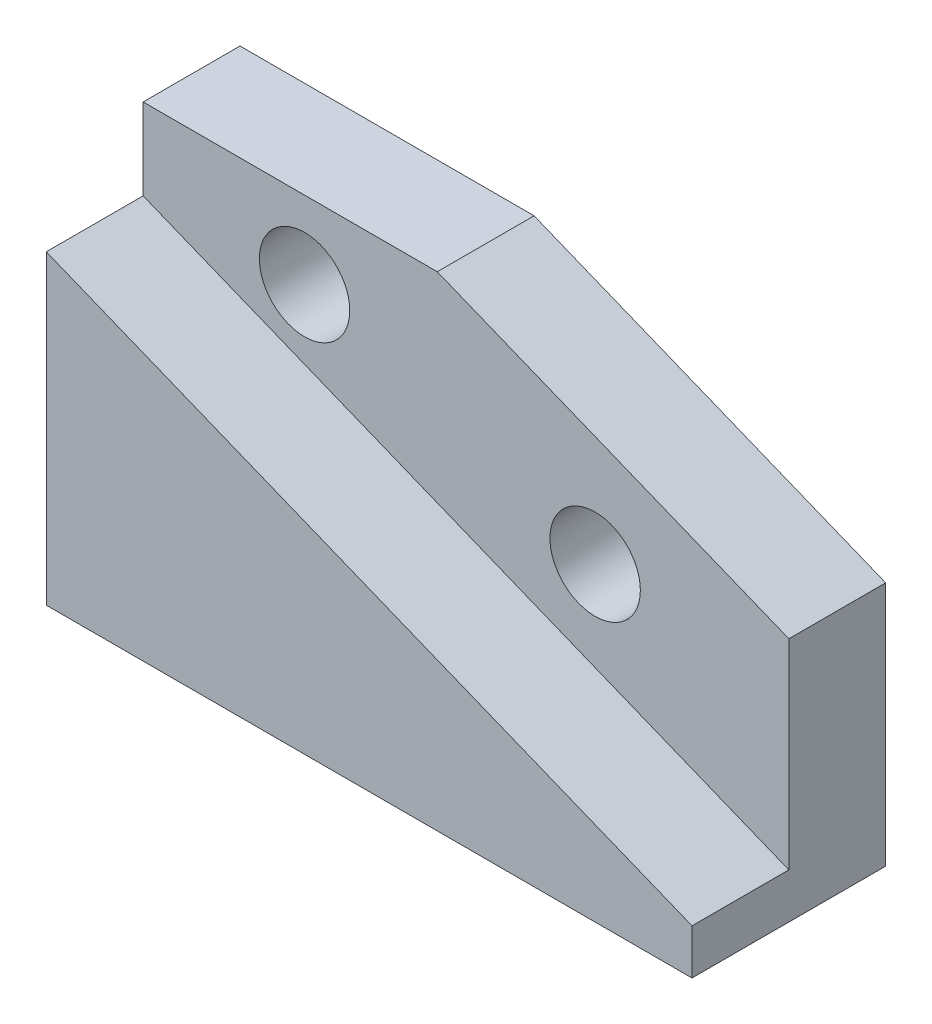
ISO-10303-21;
HEADER;
FILE_DESCRIPTION(('STEP AP214'),'2;1');
FILE_NAME('part.step','',(''),(''),'','','');
FILE_SCHEMA(('AUTOMOTIVE_DESIGN { 1 0 10303 214 1 1 1 1 }'));
ENDSEC;
DATA;
#1=APPLICATION_CONTEXT('core data for automotive mechanical design processes');
#2=APPLICATION_PROTOCOL_DEFINITION('international standard','automotive_design',2000,#1);
#3=PRODUCT_CONTEXT('',#1,'mechanical');
#4=PRODUCT('Part','Part','',(#3));
#5=PRODUCT_RELATED_PRODUCT_CATEGORY('part','',(#4));
#6=PRODUCT_DEFINITION_FORMATION('','',#4);
#7=PRODUCT_DEFINITION_CONTEXT('part definition',#1,'design');
#8=PRODUCT_DEFINITION('design','',#6,#7);
#9=PRODUCT_DEFINITION_SHAPE('','',#8);
#10=(LENGTH_UNIT() NAMED_UNIT(*) SI_UNIT(.MILLI.,.METRE.));
#11=(NAMED_UNIT(*) PLANE_ANGLE_UNIT() SI_UNIT($,.RADIAN.));
#12=(NAMED_UNIT(*) SI_UNIT($,.STERADIAN.) SOLID_ANGLE_UNIT());
#13=UNCERTAINTY_MEASURE_WITH_UNIT(LENGTH_MEASURE(1.E-05),#10,'distance_accuracy_value','');
#14=(GEOMETRIC_REPRESENTATION_CONTEXT(3) GLOBAL_UNCERTAINTY_ASSIGNED_CONTEXT((#13)) GLOBAL_UNIT_ASSIGNED_CONTEXT((#10,
#11,#12)) REPRESENTATION_CONTEXT('',''));
#15=CARTESIAN_POINT('',(0.,0.,0.));
#16=DIRECTION('',(0.,0.,1.));
#17=DIRECTION('',(1.,0.,0.));
#18=AXIS2_PLACEMENT_3D('',#15,#16,#17);
#19=CARTESIAN_POINT('',(16.4643142796737,40.7506078241349,30.));
#20=DIRECTION('',(0.374606593415909,0.927183854566789,0.));
#21=DIRECTION('',(-0.927183854566789,0.374606593415909,0.));
#22=AXIS2_PLACEMENT_3D('',#19,#20,#21);
#23=PLANE('',#22);
#24=DIRECTION('',(0.927183854566789,-0.374606593415909,0.));
#25=VECTOR('',#24,1.);
#26=CARTESIAN_POINT('',(16.4643142796737,40.7506078241349,15.));
#27=LINE('',#26,#25);
#28=CARTESIAN_POINT('',(0.,47.4026225835153,15.));
#29=VERTEX_POINT('',#28);
#30=CARTESIAN_POINT('',(100.,7.00000000000001,15.));
#31=VERTEX_POINT('',#30);
#32=EDGE_CURVE('E49',#29,#31,#27,.T.);
#33=ORIENTED_EDGE('',*,*,#32,.F.);
#34=DIRECTION('',(0.,0.,-1.));
#35=VECTOR('',#34,1.);
#36=CARTESIAN_POINT('',(0.,47.4026225835153,30.));
#37=LINE('',#36,#35);
#38=CARTESIAN_POINT('',(0.,47.4026225835153,30.));
#39=VERTEX_POINT('',#38);
#40=EDGE_CURVE('E11',#39,#29,#37,.T.);
#41=ORIENTED_EDGE('',*,*,#40,.F.);
#42=DIRECTION('',(0.927183854566789,-0.374606593415909,0.));
#43=VECTOR('',#42,1.);
#44=CARTESIAN_POINT('',(16.4643142796737,40.7506078241349,30.));
#45=LINE('',#44,#43);
#46=CARTESIAN_POINT('',(100.,7.00000000000001,30.));
#47=VERTEX_POINT('',#46);
#48=EDGE_CURVE('E144',#39,#47,#45,.T.);
#49=ORIENTED_EDGE('',*,*,#48,.T.);
#50=DIRECTION('',(0.,0.,-1.));
#51=VECTOR('',#50,1.);
#52=CARTESIAN_POINT('',(100.,7.00000000000001,30.));
#53=LINE('',#52,#51);
#54=EDGE_CURVE('E56',#47,#31,#53,.T.);
#55=ORIENTED_EDGE('',*,*,#54,.T.);
#56=EDGE_LOOP('',(#33,#41,#49,#55));
#57=FACE_BOUND('',#56,.T.);
#58=ADVANCED_FACE('F35',(#57),#23,.T.);
#59=CARTESIAN_POINT('',(0.,0.,30.));
#60=DIRECTION('',(1.,0.,0.));
#61=DIRECTION('',(0.,0.,-1.));
#62=AXIS2_PLACEMENT_3D('',#59,#60,#61);
#63=PLANE('',#62);
#64=DIRECTION('',(0.,-1.,0.));
#65=VECTOR('',#64,1.);
#66=CARTESIAN_POINT('',(0.,0.,0.));
#67=LINE('',#66,#65);
#68=CARTESIAN_POINT('',(0.,60.,0.));
#69=VERTEX_POINT('',#68);
#70=CARTESIAN_POINT('',(0.,0.,0.));
#71=VERTEX_POINT('',#70);
#72=EDGE_CURVE('E107',#69,#71,#67,.T.);
#73=ORIENTED_EDGE('',*,*,#72,.T.);
#74=DIRECTION('',(0.,0.,-1.));
#75=VECTOR('',#74,1.);
#76=CARTESIAN_POINT('',(0.,0.,30.));
#77=LINE('',#76,#75);
#78=CARTESIAN_POINT('',(0.,0.,30.));
#79=VERTEX_POINT('',#78);
#80=EDGE_CURVE('E42',#79,#71,#77,.T.);
#81=ORIENTED_EDGE('',*,*,#80,.F.);
#82=DIRECTION('',(0.,-1.,0.));
#83=VECTOR('',#82,1.);
#84=CARTESIAN_POINT('',(0.,0.,30.));
#85=LINE('',#84,#83);
#86=EDGE_CURVE('E146',#39,#79,#85,.T.);
#87=ORIENTED_EDGE('',*,*,#86,.F.);
#88=ORIENTED_EDGE('',*,*,#40,.T.);
#89=DIRECTION('',(0.,-1.,0.));
#90=VECTOR('',#89,1.);
#91=CARTESIAN_POINT('',(0.,0.,15.));
#92=LINE('',#91,#90);
#93=CARTESIAN_POINT('',(0.,60.,15.));
#94=VERTEX_POINT('',#93);
#95=EDGE_CURVE('E111',#94,#29,#92,.T.);
#96=ORIENTED_EDGE('',*,*,#95,.F.);
#97=DIRECTION('',(0.,0.,-1.));
#98=VECTOR('',#97,1.);
#99=CARTESIAN_POINT('',(0.,60.,15.));
#100=LINE('',#99,#98);
#101=EDGE_CURVE('E98',#94,#69,#100,.T.);
#102=ORIENTED_EDGE('',*,*,#101,.T.);
#103=EDGE_LOOP('',(#73,#81,#87,#88,#96,#102));
#104=FACE_BOUND('',#103,.T.);
#105=ADVANCED_FACE('F112',(#104),#63,.F.);
#106=CARTESIAN_POINT('',(0.,0.,30.));
#107=DIRECTION('',(0.,1.,0.));
#108=DIRECTION('',(0.,0.,1.));
#109=AXIS2_PLACEMENT_3D('',#106,#107,#108);
#110=PLANE('',#109);
#111=DIRECTION('',(1.,0.,0.));
#112=VECTOR('',#111,1.);
#113=CARTESIAN_POINT('',(0.,0.,0.));
#114=LINE('',#113,#112);
#115=CARTESIAN_POINT('',(100.,0.,0.));
#116=VERTEX_POINT('',#115);
#117=EDGE_CURVE('E154',#71,#116,#114,.T.);
#118=ORIENTED_EDGE('',*,*,#117,.T.);
#119=DIRECTION('',(0.,0.,-1.));
#120=VECTOR('',#119,1.);
#121=CARTESIAN_POINT('',(100.,0.,30.));
#122=LINE('',#121,#120);
#123=CARTESIAN_POINT('',(100.,0.,30.));
#124=VERTEX_POINT('',#123);
#125=EDGE_CURVE('E71',#124,#116,#122,.T.);
#126=ORIENTED_EDGE('',*,*,#125,.F.);
#127=DIRECTION('',(1.,0.,0.));
#128=VECTOR('',#127,1.);
#129=CARTESIAN_POINT('',(0.,0.,30.));
#130=LINE('',#129,#128);
#131=EDGE_CURVE('E149',#79,#124,#130,.T.);
#132=ORIENTED_EDGE('',*,*,#131,.F.);
#133=ORIENTED_EDGE('',*,*,#80,.T.);
#134=EDGE_LOOP('',(#118,#126,#132,#133));
#135=FACE_BOUND('',#134,.T.);
#136=ADVANCED_FACE('F164',(#135),#110,.F.);
#137=CARTESIAN_POINT('',(100.,1.98254111540207E-13,30.));
#138=DIRECTION('',(1.,0.,0.));
#139=DIRECTION('',(0.,1.,0.));
#140=AXIS2_PLACEMENT_3D('',#137,#138,#139);
#141=PLANE('',#140);
#142=DIRECTION('',(0.,-1.,0.));
#143=VECTOR('',#142,1.);
#144=CARTESIAN_POINT('',(100.,1.98254111540207E-13,0.));
#145=LINE('',#144,#143);
#146=CARTESIAN_POINT('',(100.,38.,0.));
#147=VERTEX_POINT('',#146);
#148=EDGE_CURVE('E147',#147,#116,#145,.T.);
#149=ORIENTED_EDGE('',*,*,#148,.F.);
#150=DIRECTION('',(0.,0.,-1.));
#151=VECTOR('',#150,1.);
#152=CARTESIAN_POINT('',(100.,38.,15.));
#153=LINE('',#152,#151);
#154=CARTESIAN_POINT('',(100.,38.,15.));
#155=VERTEX_POINT('',#154);
#156=EDGE_CURVE('E108',#155,#147,#153,.T.);
#157=ORIENTED_EDGE('',*,*,#156,.F.);
#158=DIRECTION('',(0.,-1.,0.));
#159=VECTOR('',#158,1.);
#160=CARTESIAN_POINT('',(100.,0.,15.));
#161=LINE('',#160,#159);
#162=EDGE_CURVE('E127',#155,#31,#161,.T.);
#163=ORIENTED_EDGE('',*,*,#162,.T.);
#164=ORIENTED_EDGE('',*,*,#54,.F.);
#165=DIRECTION('',(0.,-1.,0.));
#166=VECTOR('',#165,1.);
#167=CARTESIAN_POINT('',(100.,1.98254111540207E-13,30.));
#168=LINE('',#167,#166);
#169=EDGE_CURVE('E151',#47,#124,#168,.T.);
#170=ORIENTED_EDGE('',*,*,#169,.T.);
#171=ORIENTED_EDGE('',*,*,#125,.T.);
#172=EDGE_LOOP('',(#149,#157,#163,#164,#170,#171));
#173=FACE_BOUND('',#172,.T.);
#174=ADVANCED_FACE('F169',(#173),#141,.T.);
#175=CARTESIAN_POINT('',(0.,0.,30.));
#176=DIRECTION('',(0.,0.,1.));
#177=DIRECTION('',(1.,0.,0.));
#178=AXIS2_PLACEMENT_3D('',#175,#176,#177);
#179=PLANE('',#178);
#180=ORIENTED_EDGE('',*,*,#48,.F.);
#181=ORIENTED_EDGE('',*,*,#86,.T.);
#182=ORIENTED_EDGE('',*,*,#131,.T.);
#183=ORIENTED_EDGE('',*,*,#169,.F.);
#184=EDGE_LOOP('',(#180,#181,#182,#183));
#185=FACE_BOUND('',#184,.T.);
#186=ADVANCED_FACE('F196',(#185),#179,.T.);
#187=CARTESIAN_POINT('',(0.,0.,0.));
#188=DIRECTION('',(0.,0.,1.));
#189=DIRECTION('',(1.,0.,0.));
#190=AXIS2_PLACEMENT_3D('',#187,#188,#189);
#191=PLANE('',#190);
#192=ORIENTED_EDGE('',*,*,#72,.F.);
#193=DIRECTION('',(1.,0.,0.));
#194=VECTOR('',#193,1.);
#195=CARTESIAN_POINT('',(0.,60.,0.));
#196=LINE('',#195,#194);
#197=CARTESIAN_POINT('',(45.5480892248416,60.,0.));
#198=VERTEX_POINT('',#197);
#199=EDGE_CURVE('E105',#69,#198,#196,.T.);
#200=ORIENTED_EDGE('',*,*,#199,.T.);
#201=DIRECTION('',(0.927183854566787,-0.374606593415913,0.));
#202=VECTOR('',#201,1.);
#203=CARTESIAN_POINT('',(27.2315190217885,67.4003747293843,0.));
#204=LINE('',#203,#202);
#205=EDGE_CURVE('E138',#198,#147,#204,.T.);
#206=ORIENTED_EDGE('',*,*,#205,.T.);
#207=ORIENTED_EDGE('',*,*,#148,.T.);
#208=ORIENTED_EDGE('',*,*,#117,.F.);
#209=EDGE_LOOP('',(#192,#200,#206,#207,#208));
#210=FACE_BOUND('',#209,.T.);
#211=CARTESIAN_POINT('',(70.0000000000001,33.,0.));
#212=DIRECTION('',(0.,0.,1.));
#213=DIRECTION('',(1.,0.,0.));
#214=AXIS2_PLACEMENT_3D('',#211,#212,#213);
#215=CIRCLE('',#214,7.);
#216=CARTESIAN_POINT('',(77.0000000000001,33.,0.));
#217=VERTEX_POINT('',#216);
#218=EDGE_CURVE('E131',#217,#217,#215,.T.);
#219=ORIENTED_EDGE('',*,*,#218,.T.);
#220=EDGE_LOOP('',(#219));
#221=FACE_BOUND('',#220,.T.);
#222=CARTESIAN_POINT('',(25.,48.,0.));
#223=DIRECTION('',(0.,0.,1.));
#224=DIRECTION('',(1.,0.,0.));
#225=AXIS2_PLACEMENT_3D('',#222,#223,#224);
#226=CIRCLE('',#225,7.);
#227=CARTESIAN_POINT('',(32.,48.,0.));
#228=VERTEX_POINT('',#227);
#229=EDGE_CURVE('E134',#228,#228,#226,.T.);
#230=ORIENTED_EDGE('',*,*,#229,.T.);
#231=EDGE_LOOP('',(#230));
#232=FACE_BOUND('',#231,.T.);
#233=ADVANCED_FACE('F166',(#210,#221,#232),#191,.F.);
#234=CARTESIAN_POINT('',(0.,60.,15.));
#235=DIRECTION('',(0.,1.,0.));
#236=DIRECTION('',(-1.,0.,0.));
#237=AXIS2_PLACEMENT_3D('',#234,#235,#236);
#238=PLANE('',#237);
#239=ORIENTED_EDGE('',*,*,#199,.F.);
#240=ORIENTED_EDGE('',*,*,#101,.F.);
#241=DIRECTION('',(1.,0.,0.));
#242=VECTOR('',#241,1.);
#243=CARTESIAN_POINT('',(0.,60.,15.));
#244=LINE('',#243,#242);
#245=CARTESIAN_POINT('',(45.5480892248416,60.,15.));
#246=VERTEX_POINT('',#245);
#247=EDGE_CURVE('E102',#94,#246,#244,.T.);
#248=ORIENTED_EDGE('',*,*,#247,.T.);
#249=DIRECTION('',(0.,0.,-1.));
#250=VECTOR('',#249,1.);
#251=CARTESIAN_POINT('',(45.5480892248416,60.,15.));
#252=LINE('',#251,#250);
#253=EDGE_CURVE('E130',#246,#198,#252,.T.);
#254=ORIENTED_EDGE('',*,*,#253,.T.);
#255=EDGE_LOOP('',(#239,#240,#248,#254));
#256=FACE_BOUND('',#255,.T.);
#257=ADVANCED_FACE('F100',(#256),#238,.T.);
#258=CARTESIAN_POINT('',(25.,48.,15.));
#259=DIRECTION('',(0.,0.,-1.));
#260=DIRECTION('',(-1.,0.,0.));
#261=AXIS2_PLACEMENT_3D('',#258,#259,#260);
#262=CYLINDRICAL_SURFACE('',#261,7.);
#263=CARTESIAN_POINT('',(25.,48.,15.));
#264=DIRECTION('',(0.,0.,1.));
#265=DIRECTION('',(1.,0.,0.));
#266=AXIS2_PLACEMENT_3D('',#263,#264,#265);
#267=CIRCLE('',#266,7.);
#268=CARTESIAN_POINT('',(32.,48.,15.));
#269=VERTEX_POINT('',#268);
#270=EDGE_CURVE('E119',#269,#269,#267,.T.);
#271=ORIENTED_EDGE('',*,*,#270,.T.);
#272=EDGE_LOOP('',(#271));
#273=FACE_BOUND('',#272,.T.);
#274=ORIENTED_EDGE('',*,*,#229,.F.);
#275=EDGE_LOOP('',(#274));
#276=FACE_BOUND('',#275,.T.);
#277=ADVANCED_FACE('F181',(#273,#276),#262,.F.);
#278=CARTESIAN_POINT('',(70.0000000000001,33.,15.));
#279=DIRECTION('',(0.,0.,-1.));
#280=DIRECTION('',(-1.,0.,0.));
#281=AXIS2_PLACEMENT_3D('',#278,#279,#280);
#282=CYLINDRICAL_SURFACE('',#281,7.);
#283=CARTESIAN_POINT('',(70.0000000000001,33.,15.));
#284=DIRECTION('',(0.,0.,1.));
#285=DIRECTION('',(1.,0.,0.));
#286=AXIS2_PLACEMENT_3D('',#283,#284,#285);
#287=CIRCLE('',#286,7.);
#288=CARTESIAN_POINT('',(77.0000000000001,33.,15.));
#289=VERTEX_POINT('',#288);
#290=EDGE_CURVE('E122',#289,#289,#287,.T.);
#291=ORIENTED_EDGE('',*,*,#290,.T.);
#292=EDGE_LOOP('',(#291));
#293=FACE_BOUND('',#292,.T.);
#294=ORIENTED_EDGE('',*,*,#218,.F.);
#295=EDGE_LOOP('',(#294));
#296=FACE_BOUND('',#295,.T.);
#297=ADVANCED_FACE('F173',(#293,#296),#282,.F.);
#298=CARTESIAN_POINT('',(27.2315190217885,67.4003747293843,15.));
#299=DIRECTION('',(0.374606593415913,0.927183854566787,0.));
#300=DIRECTION('',(-0.927183854566787,0.374606593415913,0.));
#301=AXIS2_PLACEMENT_3D('',#298,#299,#300);
#302=PLANE('',#301);
#303=ORIENTED_EDGE('',*,*,#205,.F.);
#304=ORIENTED_EDGE('',*,*,#253,.F.);
#305=DIRECTION('',(0.927183854566787,-0.374606593415913,0.));
#306=VECTOR('',#305,1.);
#307=CARTESIAN_POINT('',(27.2315190217885,67.4003747293843,15.));
#308=LINE('',#307,#306);
#309=EDGE_CURVE('E118',#246,#155,#308,.T.);
#310=ORIENTED_EDGE('',*,*,#309,.T.);
#311=ORIENTED_EDGE('',*,*,#156,.T.);
#312=EDGE_LOOP('',(#303,#304,#310,#311));
#313=FACE_BOUND('',#312,.T.);
#314=ADVANCED_FACE('F171',(#313),#302,.T.);
#315=CARTESIAN_POINT('',(0.,0.,15.));
#316=DIRECTION('',(0.,0.,1.));
#317=DIRECTION('',(1.,0.,0.));
#318=AXIS2_PLACEMENT_3D('',#315,#316,#317);
#319=PLANE('',#318);
#320=ORIENTED_EDGE('',*,*,#290,.F.);
#321=EDGE_LOOP('',(#320));
#322=FACE_BOUND('',#321,.T.);
#323=ORIENTED_EDGE('',*,*,#270,.F.);
#324=EDGE_LOOP('',(#323));
#325=FACE_BOUND('',#324,.T.);
#326=ORIENTED_EDGE('',*,*,#247,.F.);
#327=ORIENTED_EDGE('',*,*,#95,.T.);
#328=ORIENTED_EDGE('',*,*,#32,.T.);
#329=ORIENTED_EDGE('',*,*,#162,.F.);
#330=ORIENTED_EDGE('',*,*,#309,.F.);
#331=EDGE_LOOP('',(#326,#327,#328,#329,#330));
#332=FACE_BOUND('',#331,.T.);
#333=ADVANCED_FACE('F115',(#322,#325,#332),#319,.T.);
#334=CLOSED_SHELL('',(#58,#105,#136,#174,#186,#233,#257,#277,#297,#314,#333));
#335=MANIFOLD_SOLID_BREP('B2',#334);
#336=ADVANCED_BREP_SHAPE_REPRESENTATION('',(#18,#335),#14);
#337=SHAPE_DEFINITION_REPRESENTATION(#9,#336);
ENDSEC;
END-ISO-10303-21;
